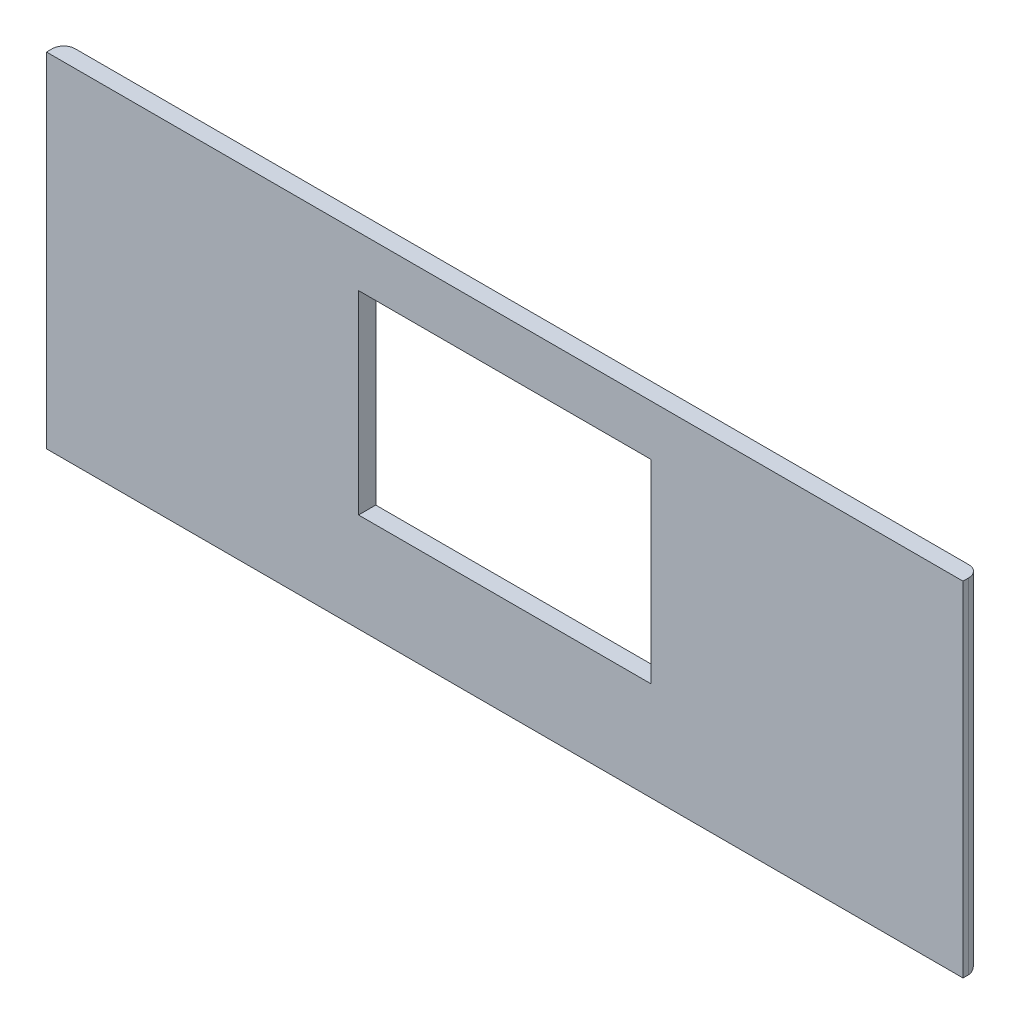
ISO-10303-21;
HEADER;
FILE_DESCRIPTION(('STEP AP214'),'2;1');
FILE_NAME('part.step','',(''),(''),'','','');
FILE_SCHEMA(('AUTOMOTIVE_DESIGN { 1 0 10303 214 1 1 1 1 }'));
ENDSEC;
DATA;
#1=APPLICATION_CONTEXT('core data for automotive mechanical design processes');
#2=APPLICATION_PROTOCOL_DEFINITION('international standard','automotive_design',2000,#1);
#3=PRODUCT_CONTEXT('',#1,'mechanical');
#4=PRODUCT('Part','Part','',(#3));
#5=PRODUCT_RELATED_PRODUCT_CATEGORY('part','',(#4));
#6=PRODUCT_DEFINITION_FORMATION('','',#4);
#7=PRODUCT_DEFINITION_CONTEXT('part definition',#1,'design');
#8=PRODUCT_DEFINITION('design','',#6,#7);
#9=PRODUCT_DEFINITION_SHAPE('','',#8);
#10=(LENGTH_UNIT() NAMED_UNIT(*) SI_UNIT(.MILLI.,.METRE.));
#11=(NAMED_UNIT(*) PLANE_ANGLE_UNIT() SI_UNIT($,.RADIAN.));
#12=(NAMED_UNIT(*) SI_UNIT($,.STERADIAN.) SOLID_ANGLE_UNIT());
#13=UNCERTAINTY_MEASURE_WITH_UNIT(LENGTH_MEASURE(1.E-05),#10,'distance_accuracy_value','');
#14=(GEOMETRIC_REPRESENTATION_CONTEXT(3) GLOBAL_UNCERTAINTY_ASSIGNED_CONTEXT((#13)) GLOBAL_UNIT_ASSIGNED_CONTEXT((#10,
#11,#12)) REPRESENTATION_CONTEXT('',''));
#15=CARTESIAN_POINT('',(0.,0.,0.));
#16=DIRECTION('',(0.,0.,1.));
#17=DIRECTION('',(1.,0.,0.));
#18=AXIS2_PLACEMENT_3D('',#15,#16,#17);
#19=CARTESIAN_POINT('',(0.,0.,3.));
#20=DIRECTION('',(1.,0.,0.));
#21=DIRECTION('',(0.,0.,-1.));
#22=AXIS2_PLACEMENT_3D('',#19,#20,#21);
#23=PLANE('',#22);
#24=DIRECTION('',(0.,0.,-1.));
#25=VECTOR('',#24,1.);
#26=CARTESIAN_POINT('',(0.,60.,3.));
#27=LINE('',#26,#25);
#28=CARTESIAN_POINT('',(0.,60.,3.));
#29=VERTEX_POINT('',#28);
#30=CARTESIAN_POINT('',(0.,60.,2.));
#31=VERTEX_POINT('',#30);
#32=EDGE_CURVE('E215',#29,#31,#27,.T.);
#33=ORIENTED_EDGE('',*,*,#32,.T.);
#34=DIRECTION('',(0.,-1.,0.));
#35=VECTOR('',#34,1.);
#36=CARTESIAN_POINT('',(0.,0.,2.));
#37=LINE('',#36,#35);
#38=CARTESIAN_POINT('',(0.,0.,2.));
#39=VERTEX_POINT('',#38);
#40=EDGE_CURVE('E243',#31,#39,#37,.T.);
#41=ORIENTED_EDGE('',*,*,#40,.T.);
#42=DIRECTION('',(0.,0.,-1.));
#43=VECTOR('',#42,1.);
#44=CARTESIAN_POINT('',(0.,0.,3.));
#45=LINE('',#44,#43);
#46=CARTESIAN_POINT('',(0.,0.,3.));
#47=VERTEX_POINT('',#46);
#48=EDGE_CURVE('E226',#47,#39,#45,.T.);
#49=ORIENTED_EDGE('',*,*,#48,.F.);
#50=DIRECTION('',(0.,-1.,0.));
#51=VECTOR('',#50,1.);
#52=CARTESIAN_POINT('',(0.,0.,3.));
#53=LINE('',#52,#51);
#54=EDGE_CURVE('E202',#29,#47,#53,.T.);
#55=ORIENTED_EDGE('',*,*,#54,.F.);
#56=EDGE_LOOP('',(#33,#41,#49,#55));
#57=FACE_BOUND('',#56,.T.);
#58=ADVANCED_FACE('F45',(#57),#23,.F.);
#59=CARTESIAN_POINT('',(0.,0.,3.));
#60=DIRECTION('',(0.,1.,0.));
#61=DIRECTION('',(0.,0.,1.));
#62=AXIS2_PLACEMENT_3D('',#59,#60,#61);
#63=PLANE('',#62);
#64=ORIENTED_EDGE('',*,*,#48,.T.);
#65=DIRECTION('',(1.,0.,0.));
#66=VECTOR('',#65,1.);
#67=CARTESIAN_POINT('',(160.,0.,2.));
#68=LINE('',#67,#66);
#69=CARTESIAN_POINT('',(160.,0.,2.));
#70=VERTEX_POINT('',#69);
#71=EDGE_CURVE('E230',#39,#70,#68,.T.);
#72=ORIENTED_EDGE('',*,*,#71,.T.);
#73=DIRECTION('',(0.,0.,-1.));
#74=VECTOR('',#73,1.);
#75=CARTESIAN_POINT('',(160.,0.,3.));
#76=LINE('',#75,#74);
#77=CARTESIAN_POINT('',(160.,0.,3.));
#78=VERTEX_POINT('',#77);
#79=EDGE_CURVE('E223',#78,#70,#76,.T.);
#80=ORIENTED_EDGE('',*,*,#79,.F.);
#81=DIRECTION('',(1.,0.,0.));
#82=VECTOR('',#81,1.);
#83=CARTESIAN_POINT('',(0.,0.,3.));
#84=LINE('',#83,#82);
#85=EDGE_CURVE('E206',#47,#78,#84,.T.);
#86=ORIENTED_EDGE('',*,*,#85,.F.);
#87=EDGE_LOOP('',(#64,#72,#80,#86));
#88=FACE_BOUND('',#87,.T.);
#89=ADVANCED_FACE('F274',(#88),#63,.F.);
#90=CARTESIAN_POINT('',(160.,0.,3.));
#91=DIRECTION('',(-1.,0.,0.));
#92=DIRECTION('',(0.,0.,1.));
#93=AXIS2_PLACEMENT_3D('',#90,#91,#92);
#94=PLANE('',#93);
#95=ORIENTED_EDGE('',*,*,#79,.T.);
#96=DIRECTION('',(0.,1.,0.));
#97=VECTOR('',#96,1.);
#98=CARTESIAN_POINT('',(160.,60.,2.));
#99=LINE('',#98,#97);
#100=CARTESIAN_POINT('',(160.,60.,2.));
#101=VERTEX_POINT('',#100);
#102=EDGE_CURVE('E11',#70,#101,#99,.T.);
#103=ORIENTED_EDGE('',*,*,#102,.T.);
#104=DIRECTION('',(0.,0.,-1.));
#105=VECTOR('',#104,1.);
#106=CARTESIAN_POINT('',(160.,60.,3.));
#107=LINE('',#106,#105);
#108=CARTESIAN_POINT('',(160.,60.,3.));
#109=VERTEX_POINT('',#108);
#110=EDGE_CURVE('E220',#109,#101,#107,.T.);
#111=ORIENTED_EDGE('',*,*,#110,.F.);
#112=DIRECTION('',(0.,1.,0.));
#113=VECTOR('',#112,1.);
#114=CARTESIAN_POINT('',(160.,0.,3.));
#115=LINE('',#114,#113);
#116=EDGE_CURVE('E209',#78,#109,#115,.T.);
#117=ORIENTED_EDGE('',*,*,#116,.F.);
#118=EDGE_LOOP('',(#95,#103,#111,#117));
#119=FACE_BOUND('',#118,.T.);
#120=ADVANCED_FACE('F277',(#119),#94,.F.);
#121=CARTESIAN_POINT('',(0.,60.,3.));
#122=DIRECTION('',(0.,-1.,0.));
#123=DIRECTION('',(0.,0.,-1.));
#124=AXIS2_PLACEMENT_3D('',#121,#122,#123);
#125=PLANE('',#124);
#126=DIRECTION('',(-1.,0.,0.));
#127=VECTOR('',#126,1.);
#128=CARTESIAN_POINT('',(0.,60.,0.));
#129=LINE('',#128,#127);
#130=CARTESIAN_POINT('',(158.,60.,0.));
#131=VERTEX_POINT('',#130);
#132=CARTESIAN_POINT('',(2.,60.,0.));
#133=VERTEX_POINT('',#132);
#134=EDGE_CURVE('E196',#131,#133,#129,.T.);
#135=ORIENTED_EDGE('',*,*,#134,.T.);
#136=CARTESIAN_POINT('',(2.,60.,2.));
#137=DIRECTION('',(0.,-1.,0.));
#138=DIRECTION('',(0.,0.,-1.));
#139=AXIS2_PLACEMENT_3D('',#136,#137,#138);
#140=CIRCLE('',#139,2.);
#141=EDGE_CURVE('E55',#133,#31,#140,.F.);
#142=ORIENTED_EDGE('',*,*,#141,.T.);
#143=ORIENTED_EDGE('',*,*,#32,.F.);
#144=DIRECTION('',(-1.,0.,0.));
#145=VECTOR('',#144,1.);
#146=CARTESIAN_POINT('',(0.,60.,3.));
#147=LINE('',#146,#145);
#148=EDGE_CURVE('E212',#109,#29,#147,.T.);
#149=ORIENTED_EDGE('',*,*,#148,.F.);
#150=ORIENTED_EDGE('',*,*,#110,.T.);
#151=CARTESIAN_POINT('',(158.,60.,2.));
#152=DIRECTION('',(0.,-1.,0.));
#153=DIRECTION('',(0.,0.,-1.));
#154=AXIS2_PLACEMENT_3D('',#151,#152,#153);
#155=CIRCLE('',#154,2.);
#156=EDGE_CURVE('E246',#101,#131,#155,.F.);
#157=ORIENTED_EDGE('',*,*,#156,.T.);
#158=EDGE_LOOP('',(#135,#142,#143,#149,#150,#157));
#159=FACE_BOUND('',#158,.T.);
#160=ADVANCED_FACE('F267',(#159),#125,.F.);
#161=CARTESIAN_POINT('',(0.,0.,3.));
#162=DIRECTION('',(0.,0.,-1.));
#163=DIRECTION('',(-1.,0.,0.));
#164=AXIS2_PLACEMENT_3D('',#161,#162,#163);
#165=PLANE('',#164);
#166=DIRECTION('',(1.,0.,0.));
#167=VECTOR('',#166,1.);
#168=CARTESIAN_POINT('',(105.523448481197,51.1704823301678,3.));
#169=LINE('',#168,#167);
#170=CARTESIAN_POINT('',(54.4765515188023,51.1704823301678,3.));
#171=VERTEX_POINT('',#170);
#172=CARTESIAN_POINT('',(105.523448481197,51.1704823301678,3.));
#173=VERTEX_POINT('',#172);
#174=EDGE_CURVE('E159',#171,#173,#169,.T.);
#175=ORIENTED_EDGE('',*,*,#174,.T.);
#176=DIRECTION('',(0.,-1.,0.));
#177=VECTOR('',#176,1.);
#178=CARTESIAN_POINT('',(105.523448481197,51.1704823301678,3.));
#179=LINE('',#178,#177);
#180=CARTESIAN_POINT('',(105.523448481197,17.2417036730287,3.));
#181=VERTEX_POINT('',#180);
#182=EDGE_CURVE('E150',#173,#181,#179,.T.);
#183=ORIENTED_EDGE('',*,*,#182,.T.);
#184=DIRECTION('',(-1.,0.,0.));
#185=VECTOR('',#184,1.);
#186=CARTESIAN_POINT('',(105.523448481197,17.2417036730287,3.));
#187=LINE('',#186,#185);
#188=CARTESIAN_POINT('',(54.4765515188023,17.2417036730287,3.));
#189=VERTEX_POINT('',#188);
#190=EDGE_CURVE('E163',#181,#189,#187,.T.);
#191=ORIENTED_EDGE('',*,*,#190,.T.);
#192=DIRECTION('',(0.,1.,0.));
#193=VECTOR('',#192,1.);
#194=CARTESIAN_POINT('',(54.4765515188023,51.1704823301678,3.));
#195=LINE('',#194,#193);
#196=EDGE_CURVE('E168',#189,#171,#195,.T.);
#197=ORIENTED_EDGE('',*,*,#196,.T.);
#198=EDGE_LOOP('',(#175,#183,#191,#197));
#199=FACE_BOUND('',#198,.T.);
#200=ORIENTED_EDGE('',*,*,#54,.T.);
#201=ORIENTED_EDGE('',*,*,#85,.T.);
#202=ORIENTED_EDGE('',*,*,#116,.T.);
#203=ORIENTED_EDGE('',*,*,#148,.T.);
#204=EDGE_LOOP('',(#200,#201,#202,#203));
#205=FACE_BOUND('',#204,.T.);
#206=ADVANCED_FACE('F170',(#199,#205),#165,.F.);
#207=CARTESIAN_POINT('',(0.,0.,0.));
#208=DIRECTION('',(0.,0.,-1.));
#209=DIRECTION('',(-1.,0.,0.));
#210=AXIS2_PLACEMENT_3D('',#207,#208,#209);
#211=PLANE('',#210);
#212=DIRECTION('',(0.,-1.,0.));
#213=VECTOR('',#212,1.);
#214=CARTESIAN_POINT('',(105.523448481197,51.1704823301678,0.));
#215=LINE('',#214,#213);
#216=CARTESIAN_POINT('',(105.523448481197,51.1704823301678,0.));
#217=VERTEX_POINT('',#216);
#218=CARTESIAN_POINT('',(105.523448481197,17.2417036730287,0.));
#219=VERTEX_POINT('',#218);
#220=EDGE_CURVE('E153',#217,#219,#215,.T.);
#221=ORIENTED_EDGE('',*,*,#220,.F.);
#222=DIRECTION('',(1.,0.,0.));
#223=VECTOR('',#222,1.);
#224=CARTESIAN_POINT('',(105.523448481197,51.1704823301678,0.));
#225=LINE('',#224,#223);
#226=CARTESIAN_POINT('',(54.4765515188023,51.1704823301678,0.));
#227=VERTEX_POINT('',#226);
#228=EDGE_CURVE('E174',#227,#217,#225,.T.);
#229=ORIENTED_EDGE('',*,*,#228,.F.);
#230=DIRECTION('',(0.,1.,0.));
#231=VECTOR('',#230,1.);
#232=CARTESIAN_POINT('',(54.4765515188023,51.1704823301678,0.));
#233=LINE('',#232,#231);
#234=CARTESIAN_POINT('',(54.4765515188023,17.2417036730287,0.));
#235=VERTEX_POINT('',#234);
#236=EDGE_CURVE('E179',#235,#227,#233,.T.);
#237=ORIENTED_EDGE('',*,*,#236,.F.);
#238=DIRECTION('',(-1.,0.,0.));
#239=VECTOR('',#238,1.);
#240=CARTESIAN_POINT('',(105.523448481197,17.2417036730287,0.));
#241=LINE('',#240,#239);
#242=EDGE_CURVE('E187',#219,#235,#241,.T.);
#243=ORIENTED_EDGE('',*,*,#242,.F.);
#244=EDGE_LOOP('',(#221,#229,#237,#243));
#245=FACE_BOUND('',#244,.T.);
#246=DIRECTION('',(1.,0.,0.));
#247=VECTOR('',#246,1.);
#248=CARTESIAN_POINT('',(0.,2.,0.));
#249=LINE('',#248,#247);
#250=CARTESIAN_POINT('',(158.,2.,0.));
#251=VERTEX_POINT('',#250);
#252=CARTESIAN_POINT('',(2.,2.,0.));
#253=VERTEX_POINT('',#252);
#254=EDGE_CURVE('E237',#251,#253,#249,.F.);
#255=ORIENTED_EDGE('',*,*,#254,.T.);
#256=DIRECTION('',(0.,-1.,0.));
#257=VECTOR('',#256,1.);
#258=CARTESIAN_POINT('',(2.,60.,0.));
#259=LINE('',#258,#257);
#260=EDGE_CURVE('E240',#253,#133,#259,.F.);
#261=ORIENTED_EDGE('',*,*,#260,.T.);
#262=ORIENTED_EDGE('',*,*,#134,.F.);
#263=DIRECTION('',(0.,1.,0.));
#264=VECTOR('',#263,1.);
#265=CARTESIAN_POINT('',(158.,0.,0.));
#266=LINE('',#265,#264);
#267=EDGE_CURVE('E234',#131,#251,#266,.F.);
#268=ORIENTED_EDGE('',*,*,#267,.T.);
#269=EDGE_LOOP('',(#255,#261,#262,#268));
#270=FACE_BOUND('',#269,.T.);
#271=ADVANCED_FACE('F265',(#245,#270),#211,.T.);
#272=CARTESIAN_POINT('',(105.523448481197,51.1704823301678,3.));
#273=DIRECTION('',(1.,0.,0.));
#274=DIRECTION('',(0.,0.,-1.));
#275=AXIS2_PLACEMENT_3D('',#272,#273,#274);
#276=PLANE('',#275);
#277=ORIENTED_EDGE('',*,*,#220,.T.);
#278=DIRECTION('',(0.,0.,-1.));
#279=VECTOR('',#278,1.);
#280=CARTESIAN_POINT('',(105.523448481197,17.2417036730287,3.));
#281=LINE('',#280,#279);
#282=EDGE_CURVE('E146',#181,#219,#281,.T.);
#283=ORIENTED_EDGE('',*,*,#282,.F.);
#284=ORIENTED_EDGE('',*,*,#182,.F.);
#285=DIRECTION('',(0.,0.,-1.));
#286=VECTOR('',#285,1.);
#287=CARTESIAN_POINT('',(105.523448481197,51.1704823301678,3.));
#288=LINE('',#287,#286);
#289=EDGE_CURVE('E193',#173,#217,#288,.T.);
#290=ORIENTED_EDGE('',*,*,#289,.T.);
#291=EDGE_LOOP('',(#277,#283,#284,#290));
#292=FACE_BOUND('',#291,.T.);
#293=ADVANCED_FACE('F148',(#292),#276,.F.);
#294=CARTESIAN_POINT('',(105.523448481197,51.1704823301678,3.));
#295=DIRECTION('',(0.,1.,0.));
#296=DIRECTION('',(0.,0.,1.));
#297=AXIS2_PLACEMENT_3D('',#294,#295,#296);
#298=PLANE('',#297);
#299=ORIENTED_EDGE('',*,*,#228,.T.);
#300=ORIENTED_EDGE('',*,*,#289,.F.);
#301=ORIENTED_EDGE('',*,*,#174,.F.);
#302=DIRECTION('',(0.,0.,-1.));
#303=VECTOR('',#302,1.);
#304=CARTESIAN_POINT('',(54.4765515188023,51.1704823301678,3.));
#305=LINE('',#304,#303);
#306=EDGE_CURVE('E197',#171,#227,#305,.T.);
#307=ORIENTED_EDGE('',*,*,#306,.T.);
#308=EDGE_LOOP('',(#299,#300,#301,#307));
#309=FACE_BOUND('',#308,.T.);
#310=ADVANCED_FACE('F301',(#309),#298,.F.);
#311=CARTESIAN_POINT('',(54.4765515188023,51.1704823301678,3.));
#312=DIRECTION('',(-1.,0.,0.));
#313=DIRECTION('',(0.,-1.,0.));
#314=AXIS2_PLACEMENT_3D('',#311,#312,#313);
#315=PLANE('',#314);
#316=ORIENTED_EDGE('',*,*,#236,.T.);
#317=ORIENTED_EDGE('',*,*,#306,.F.);
#318=ORIENTED_EDGE('',*,*,#196,.F.);
#319=DIRECTION('',(0.,0.,-1.));
#320=VECTOR('',#319,1.);
#321=CARTESIAN_POINT('',(54.4765515188023,17.2417036730287,3.));
#322=LINE('',#321,#320);
#323=EDGE_CURVE('E158',#189,#235,#322,.T.);
#324=ORIENTED_EDGE('',*,*,#323,.T.);
#325=EDGE_LOOP('',(#316,#317,#318,#324));
#326=FACE_BOUND('',#325,.T.);
#327=ADVANCED_FACE('F296',(#326),#315,.F.);
#328=CARTESIAN_POINT('',(105.523448481197,17.2417036730287,3.));
#329=DIRECTION('',(0.,-1.,0.));
#330=DIRECTION('',(0.,0.,-1.));
#331=AXIS2_PLACEMENT_3D('',#328,#329,#330);
#332=PLANE('',#331);
#333=ORIENTED_EDGE('',*,*,#242,.T.);
#334=ORIENTED_EDGE('',*,*,#323,.F.);
#335=ORIENTED_EDGE('',*,*,#190,.F.);
#336=ORIENTED_EDGE('',*,*,#282,.T.);
#337=EDGE_LOOP('',(#333,#334,#335,#336));
#338=FACE_BOUND('',#337,.T.);
#339=ADVANCED_FACE('F164',(#338),#332,.F.);
#340=CARTESIAN_POINT('',(2.,0.,2.));
#341=DIRECTION('',(0.,1.,0.));
#342=DIRECTION('',(0.,0.,1.));
#343=AXIS2_PLACEMENT_3D('',#340,#341,#342);
#344=CYLINDRICAL_SURFACE('',#343,2.);
#345=ORIENTED_EDGE('',*,*,#141,.F.);
#346=ORIENTED_EDGE('',*,*,#260,.F.);
#347=CARTESIAN_POINT('',(2.,2.,2.));
#348=DIRECTION('',(-0.707106781186547,0.707106781186547,0.));
#349=DIRECTION('',(0.707106781186547,0.707106781186547,0.));
#350=AXIS2_PLACEMENT_3D('',#347,#348,#349);
#351=ELLIPSE('',#350,2.82842712474619,2.);
#352=EDGE_CURVE('E49',#39,#253,#351,.F.);
#353=ORIENTED_EDGE('',*,*,#352,.F.);
#354=ORIENTED_EDGE('',*,*,#40,.F.);
#355=EDGE_LOOP('',(#345,#346,#353,#354));
#356=FACE_BOUND('',#355,.T.);
#357=ADVANCED_FACE('F47',(#356),#344,.T.);
#358=CARTESIAN_POINT('',(158.,0.,2.));
#359=DIRECTION('',(0.,-1.,0.));
#360=DIRECTION('',(0.,0.,-1.));
#361=AXIS2_PLACEMENT_3D('',#358,#359,#360);
#362=CYLINDRICAL_SURFACE('',#361,2.);
#363=ORIENTED_EDGE('',*,*,#156,.F.);
#364=ORIENTED_EDGE('',*,*,#102,.F.);
#365=CARTESIAN_POINT('',(158.,2.,2.));
#366=DIRECTION('',(-0.707106781186547,-0.707106781186547,0.));
#367=DIRECTION('',(0.707106781186547,-0.707106781186547,0.));
#368=AXIS2_PLACEMENT_3D('',#365,#366,#367);
#369=ELLIPSE('',#368,2.82842712474619,2.);
#370=EDGE_CURVE('E250',#251,#70,#369,.T.);
#371=ORIENTED_EDGE('',*,*,#370,.F.);
#372=ORIENTED_EDGE('',*,*,#267,.F.);
#373=EDGE_LOOP('',(#363,#364,#371,#372));
#374=FACE_BOUND('',#373,.T.);
#375=ADVANCED_FACE('F271',(#374),#362,.T.);
#376=CARTESIAN_POINT('',(0.,2.,2.));
#377=DIRECTION('',(-1.,0.,0.));
#378=DIRECTION('',(0.,0.,1.));
#379=AXIS2_PLACEMENT_3D('',#376,#377,#378);
#380=CYLINDRICAL_SURFACE('',#379,2.);
#381=ORIENTED_EDGE('',*,*,#352,.T.);
#382=ORIENTED_EDGE('',*,*,#254,.F.);
#383=ORIENTED_EDGE('',*,*,#370,.T.);
#384=ORIENTED_EDGE('',*,*,#71,.F.);
#385=EDGE_LOOP('',(#381,#382,#383,#384));
#386=FACE_BOUND('',#385,.T.);
#387=ADVANCED_FACE('F259',(#386),#380,.T.);
#388=CLOSED_SHELL('',(#58,#89,#120,#160,#206,#271,#293,#310,#327,#339,#357,#375,#387));
#389=MANIFOLD_SOLID_BREP('B2',#388);
#390=ADVANCED_BREP_SHAPE_REPRESENTATION('',(#18,#389),#14);
#391=SHAPE_DEFINITION_REPRESENTATION(#9,#390);
ENDSEC;
END-ISO-10303-21;
